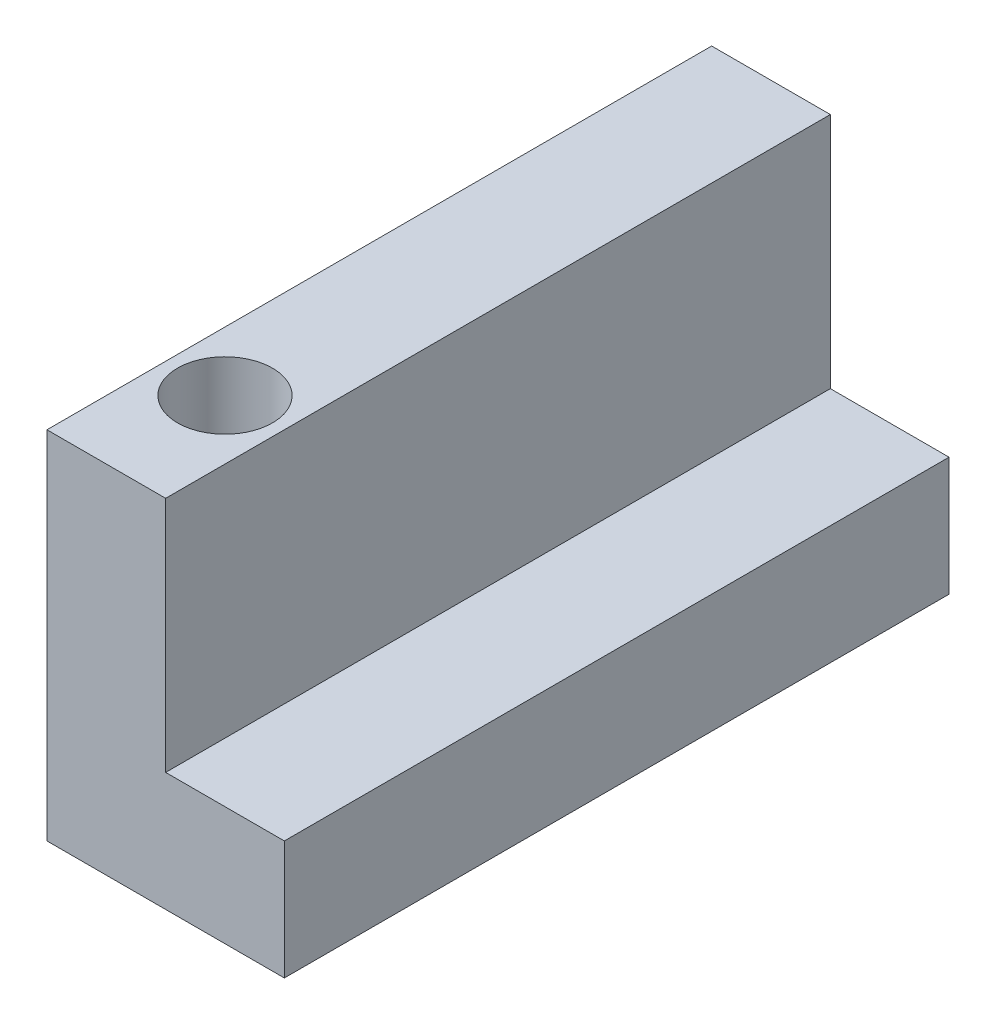
ISO-10303-21;
HEADER;
FILE_DESCRIPTION(('STEP AP214'),'2;1');
FILE_NAME('part.step','',(''),(''),'','','');
FILE_SCHEMA(('AUTOMOTIVE_DESIGN { 1 0 10303 214 1 1 1 1 }'));
ENDSEC;
DATA;
#1=APPLICATION_CONTEXT('core data for automotive mechanical design processes');
#2=APPLICATION_PROTOCOL_DEFINITION('international standard','automotive_design',2000,#1);
#3=PRODUCT_CONTEXT('',#1,'mechanical');
#4=PRODUCT('Part','Part','',(#3));
#5=PRODUCT_RELATED_PRODUCT_CATEGORY('part','',(#4));
#6=PRODUCT_DEFINITION_FORMATION('','',#4);
#7=PRODUCT_DEFINITION_CONTEXT('part definition',#1,'design');
#8=PRODUCT_DEFINITION('design','',#6,#7);
#9=PRODUCT_DEFINITION_SHAPE('','',#8);
#10=(LENGTH_UNIT() NAMED_UNIT(*) SI_UNIT(.MILLI.,.METRE.));
#11=(NAMED_UNIT(*) PLANE_ANGLE_UNIT() SI_UNIT($,.RADIAN.));
#12=(NAMED_UNIT(*) SI_UNIT($,.STERADIAN.) SOLID_ANGLE_UNIT());
#13=UNCERTAINTY_MEASURE_WITH_UNIT(LENGTH_MEASURE(1.E-05),#10,'distance_accuracy_value','');
#14=(GEOMETRIC_REPRESENTATION_CONTEXT(3) GLOBAL_UNCERTAINTY_ASSIGNED_CONTEXT((#13)) GLOBAL_UNIT_ASSIGNED_CONTEXT((#10,
#11,#12)) REPRESENTATION_CONTEXT('',''));
#15=CARTESIAN_POINT('',(0.,0.,0.));
#16=DIRECTION('',(0.,0.,1.));
#17=DIRECTION('',(1.,0.,0.));
#18=AXIS2_PLACEMENT_3D('',#15,#16,#17);
#19=CARTESIAN_POINT('',(0.,6.35,-381.));
#20=DIRECTION('',(1.,0.,0.));
#21=DIRECTION('',(0.,0.,-1.));
#22=AXIS2_PLACEMENT_3D('',#19,#20,#21);
#23=PLANE('',#22);
#24=DIRECTION('',(0.,-1.,0.));
#25=VECTOR('',#24,1.);
#26=CARTESIAN_POINT('',(0.,6.35,-35.56));
#27=LINE('',#26,#25);
#28=CARTESIAN_POINT('',(0.,6.35,-35.56));
#29=VERTEX_POINT('',#28);
#30=CARTESIAN_POINT('',(0.,0.,-35.56));
#31=VERTEX_POINT('',#30);
#32=EDGE_CURVE('E101',#29,#31,#27,.T.);
#33=ORIENTED_EDGE('',*,*,#32,.F.);
#34=DIRECTION('',(0.,0.,1.));
#35=VECTOR('',#34,1.);
#36=CARTESIAN_POINT('',(0.,6.35,-381.));
#37=LINE('',#36,#35);
#38=CARTESIAN_POINT('',(0.,6.35,0.));
#39=VERTEX_POINT('',#38);
#40=EDGE_CURVE('E45',#29,#39,#37,.T.);
#41=ORIENTED_EDGE('',*,*,#40,.T.);
#42=DIRECTION('',(0.,1.,0.));
#43=VECTOR('',#42,1.);
#44=CARTESIAN_POINT('',(0.,6.35,0.));
#45=LINE('',#44,#43);
#46=CARTESIAN_POINT('',(0.,0.,0.));
#47=VERTEX_POINT('',#46);
#48=EDGE_CURVE('E153',#47,#39,#45,.T.);
#49=ORIENTED_EDGE('',*,*,#48,.F.);
#50=DIRECTION('',(0.,0.,1.));
#51=VECTOR('',#50,1.);
#52=CARTESIAN_POINT('',(0.,0.,-381.));
#53=LINE('',#52,#51);
#54=EDGE_CURVE('E11',#31,#47,#53,.T.);
#55=ORIENTED_EDGE('',*,*,#54,.F.);
#56=EDGE_LOOP('',(#33,#41,#49,#55));
#57=FACE_BOUND('',#56,.T.);
#58=ADVANCED_FACE('F42',(#57),#23,.T.);
#59=CARTESIAN_POINT('',(0.,0.,-381.));
#60=DIRECTION('',(0.,-1.,0.));
#61=DIRECTION('',(1.,0.,0.));
#62=AXIS2_PLACEMENT_3D('',#59,#60,#61);
#63=PLANE('',#62);
#64=DIRECTION('',(0.,0.,1.));
#65=VECTOR('',#64,1.);
#66=CARTESIAN_POINT('',(-12.7,0.,-381.));
#67=LINE('',#66,#65);
#68=CARTESIAN_POINT('',(-12.7,0.,-35.56));
#69=VERTEX_POINT('',#68);
#70=CARTESIAN_POINT('',(-12.7,0.,0.));
#71=VERTEX_POINT('',#70);
#72=EDGE_CURVE('E51',#69,#71,#67,.T.);
#73=ORIENTED_EDGE('',*,*,#72,.F.);
#74=DIRECTION('',(-1.,0.,0.));
#75=VECTOR('',#74,1.);
#76=CARTESIAN_POINT('',(-6.35,0.,-35.56));
#77=LINE('',#76,#75);
#78=EDGE_CURVE('E96',#31,#69,#77,.T.);
#79=ORIENTED_EDGE('',*,*,#78,.F.);
#80=ORIENTED_EDGE('',*,*,#54,.T.);
#81=DIRECTION('',(1.,0.,0.));
#82=VECTOR('',#81,1.);
#83=CARTESIAN_POINT('',(0.,0.,0.));
#84=LINE('',#83,#82);
#85=EDGE_CURVE('E115',#71,#47,#84,.T.);
#86=ORIENTED_EDGE('',*,*,#85,.F.);
#87=EDGE_LOOP('',(#73,#79,#80,#86));
#88=FACE_BOUND('',#87,.T.);
#89=CARTESIAN_POINT('',(-9.525,0.,-6.35));
#90=DIRECTION('',(0.,-1.,0.));
#91=DIRECTION('',(1.,0.,0.));
#92=AXIS2_PLACEMENT_3D('',#89,#90,#91);
#93=CIRCLE('',#92,2.54);
#94=CARTESIAN_POINT('',(-6.985,0.,-6.35));
#95=VERTEX_POINT('',#94);
#96=EDGE_CURVE('E161',#95,#95,#93,.T.);
#97=ORIENTED_EDGE('',*,*,#96,.F.);
#98=EDGE_LOOP('',(#97));
#99=FACE_BOUND('',#98,.T.);
#100=ADVANCED_FACE('F112',(#88,#99),#63,.T.);
#101=CARTESIAN_POINT('',(-12.7,0.,-381.));
#102=DIRECTION('',(-1.,0.,0.));
#103=DIRECTION('',(0.,-1.,0.));
#104=AXIS2_PLACEMENT_3D('',#101,#102,#103);
#105=PLANE('',#104);
#106=DIRECTION('',(0.,-1.,0.));
#107=VECTOR('',#106,1.);
#108=CARTESIAN_POINT('',(-12.7,0.,-35.56));
#109=LINE('',#108,#107);
#110=CARTESIAN_POINT('',(-12.7,19.05,-35.56));
#111=VERTEX_POINT('',#110);
#112=EDGE_CURVE('E98',#111,#69,#109,.T.);
#113=ORIENTED_EDGE('',*,*,#112,.T.);
#114=ORIENTED_EDGE('',*,*,#72,.T.);
#115=DIRECTION('',(0.,-1.,0.));
#116=VECTOR('',#115,1.);
#117=CARTESIAN_POINT('',(-12.7,0.,0.));
#118=LINE('',#117,#116);
#119=CARTESIAN_POINT('',(-12.7,19.05,0.));
#120=VERTEX_POINT('',#119);
#121=EDGE_CURVE('E135',#120,#71,#118,.T.);
#122=ORIENTED_EDGE('',*,*,#121,.F.);
#123=DIRECTION('',(0.,0.,1.));
#124=VECTOR('',#123,1.);
#125=CARTESIAN_POINT('',(-12.7,19.05,-381.));
#126=LINE('',#125,#124);
#127=EDGE_CURVE('E107',#111,#120,#126,.T.);
#128=ORIENTED_EDGE('',*,*,#127,.F.);
#129=EDGE_LOOP('',(#113,#114,#122,#128));
#130=FACE_BOUND('',#129,.T.);
#131=ADVANCED_FACE('F106',(#130),#105,.T.);
#132=CARTESIAN_POINT('',(-12.7,19.05,-381.));
#133=DIRECTION('',(0.,1.,0.));
#134=DIRECTION('',(0.,0.,1.));
#135=AXIS2_PLACEMENT_3D('',#132,#133,#134);
#136=PLANE('',#135);
#137=DIRECTION('',(1.,0.,0.));
#138=VECTOR('',#137,1.);
#139=CARTESIAN_POINT('',(-12.7,19.05,-35.56));
#140=LINE('',#139,#138);
#141=CARTESIAN_POINT('',(-6.35,19.05,-35.56));
#142=VERTEX_POINT('',#141);
#143=EDGE_CURVE('E109',#111,#142,#140,.T.);
#144=ORIENTED_EDGE('',*,*,#143,.F.);
#145=ORIENTED_EDGE('',*,*,#127,.T.);
#146=DIRECTION('',(-1.,0.,0.));
#147=VECTOR('',#146,1.);
#148=CARTESIAN_POINT('',(-12.7,19.05,0.));
#149=LINE('',#148,#147);
#150=CARTESIAN_POINT('',(-6.35,19.05,0.));
#151=VERTEX_POINT('',#150);
#152=EDGE_CURVE('E139',#151,#120,#149,.T.);
#153=ORIENTED_EDGE('',*,*,#152,.F.);
#154=DIRECTION('',(0.,0.,1.));
#155=VECTOR('',#154,1.);
#156=CARTESIAN_POINT('',(-6.35,19.05,-381.));
#157=LINE('',#156,#155);
#158=EDGE_CURVE('E119',#142,#151,#157,.T.);
#159=ORIENTED_EDGE('',*,*,#158,.F.);
#160=EDGE_LOOP('',(#144,#145,#153,#159));
#161=FACE_BOUND('',#160,.T.);
#162=CARTESIAN_POINT('',(-9.525,19.05,-6.35));
#163=DIRECTION('',(0.,1.,0.));
#164=DIRECTION('',(0.,0.,1.));
#165=AXIS2_PLACEMENT_3D('',#162,#163,#164);
#166=CIRCLE('',#165,2.54);
#167=CARTESIAN_POINT('',(-9.525,19.05,-3.81));
#168=VERTEX_POINT('',#167);
#169=EDGE_CURVE('E157',#168,#168,#166,.T.);
#170=ORIENTED_EDGE('',*,*,#169,.F.);
#171=EDGE_LOOP('',(#170));
#172=FACE_BOUND('',#171,.T.);
#173=ADVANCED_FACE('F194',(#161,#172),#136,.T.);
#174=CARTESIAN_POINT('',(-6.35,19.05,-381.));
#175=DIRECTION('',(1.,0.,0.));
#176=DIRECTION('',(0.,1.,0.));
#177=AXIS2_PLACEMENT_3D('',#174,#175,#176);
#178=PLANE('',#177);
#179=DIRECTION('',(0.,-1.,0.));
#180=VECTOR('',#179,1.);
#181=CARTESIAN_POINT('',(-6.35,0.,-35.56));
#182=LINE('',#181,#180);
#183=CARTESIAN_POINT('',(-6.35,6.35,-35.56));
#184=VERTEX_POINT('',#183);
#185=EDGE_CURVE('E110',#142,#184,#182,.T.);
#186=ORIENTED_EDGE('',*,*,#185,.F.);
#187=ORIENTED_EDGE('',*,*,#158,.T.);
#188=DIRECTION('',(0.,1.,0.));
#189=VECTOR('',#188,1.);
#190=CARTESIAN_POINT('',(-6.35,19.05,0.));
#191=LINE('',#190,#189);
#192=CARTESIAN_POINT('',(-6.35,6.35,0.));
#193=VERTEX_POINT('',#192);
#194=EDGE_CURVE('E145',#193,#151,#191,.T.);
#195=ORIENTED_EDGE('',*,*,#194,.F.);
#196=DIRECTION('',(0.,0.,1.));
#197=VECTOR('',#196,1.);
#198=CARTESIAN_POINT('',(-6.35,6.35,-381.));
#199=LINE('',#198,#197);
#200=EDGE_CURVE('E124',#184,#193,#199,.T.);
#201=ORIENTED_EDGE('',*,*,#200,.F.);
#202=EDGE_LOOP('',(#186,#187,#195,#201));
#203=FACE_BOUND('',#202,.T.);
#204=ADVANCED_FACE('F183',(#203),#178,.T.);
#205=CARTESIAN_POINT('',(-6.35,6.35,-381.));
#206=DIRECTION('',(0.,1.,0.));
#207=DIRECTION('',(0.,0.,1.));
#208=AXIS2_PLACEMENT_3D('',#205,#206,#207);
#209=PLANE('',#208);
#210=DIRECTION('',(1.,0.,0.));
#211=VECTOR('',#210,1.);
#212=CARTESIAN_POINT('',(-6.35,6.35,-35.56));
#213=LINE('',#212,#211);
#214=EDGE_CURVE('E173',#184,#29,#213,.T.);
#215=ORIENTED_EDGE('',*,*,#214,.F.);
#216=ORIENTED_EDGE('',*,*,#200,.T.);
#217=DIRECTION('',(-1.,0.,0.));
#218=VECTOR('',#217,1.);
#219=CARTESIAN_POINT('',(-6.35,6.35,0.));
#220=LINE('',#219,#218);
#221=EDGE_CURVE('E149',#39,#193,#220,.T.);
#222=ORIENTED_EDGE('',*,*,#221,.F.);
#223=ORIENTED_EDGE('',*,*,#40,.F.);
#224=EDGE_LOOP('',(#215,#216,#222,#223));
#225=FACE_BOUND('',#224,.T.);
#226=ADVANCED_FACE('F182',(#225),#209,.T.);
#227=CARTESIAN_POINT('',(0.,0.,0.));
#228=DIRECTION('',(0.,0.,-1.));
#229=DIRECTION('',(-1.,0.,0.));
#230=AXIS2_PLACEMENT_3D('',#227,#228,#229);
#231=PLANE('',#230);
#232=ORIENTED_EDGE('',*,*,#48,.T.);
#233=ORIENTED_EDGE('',*,*,#221,.T.);
#234=ORIENTED_EDGE('',*,*,#194,.T.);
#235=ORIENTED_EDGE('',*,*,#152,.T.);
#236=ORIENTED_EDGE('',*,*,#121,.T.);
#237=ORIENTED_EDGE('',*,*,#85,.T.);
#238=EDGE_LOOP('',(#232,#233,#234,#235,#236,#237));
#239=FACE_BOUND('',#238,.T.);
#240=ADVANCED_FACE('F185',(#239),#231,.F.);
#241=CARTESIAN_POINT('',(-9.525,11.43,-6.35));
#242=DIRECTION('',(0.,1.,0.));
#243=DIRECTION('',(0.,0.,1.));
#244=AXIS2_PLACEMENT_3D('',#241,#242,#243);
#245=CYLINDRICAL_SURFACE('',#244,2.54);
#246=CARTESIAN_POINT('',(-9.525,11.43,-6.35));
#247=DIRECTION('',(0.,1.,0.));
#248=DIRECTION('',(0.,0.,1.));
#249=AXIS2_PLACEMENT_3D('',#246,#247,#248);
#250=CIRCLE('',#249,2.54);
#251=CARTESIAN_POINT('',(-9.525,11.43,-3.81));
#252=VERTEX_POINT('',#251);
#253=EDGE_CURVE('E156',#252,#252,#250,.T.);
#254=CARTESIAN_POINT('',(-9.525,11.43,-3.81));
#255=CARTESIAN_POINT('',(-9.525,11.509375,-3.81));
#256=CARTESIAN_POINT('',(-9.525,11.58875,-3.81));
#257=CARTESIAN_POINT('',(-9.525,11.7475,-3.81));
#258=CARTESIAN_POINT('',(-9.525,11.826875,-3.81));
#259=CARTESIAN_POINT('',(-9.525,11.985625,-3.81));
#260=CARTESIAN_POINT('',(-9.525,12.065,-3.81));
#261=CARTESIAN_POINT('',(-9.525,12.22375,-3.81));
#262=CARTESIAN_POINT('',(-9.525,12.303125,-3.81));
#263=CARTESIAN_POINT('',(-9.525,12.461875,-3.81));
#264=CARTESIAN_POINT('',(-9.525,12.54125,-3.81));
#265=CARTESIAN_POINT('',(-9.525,12.7,-3.81));
#266=CARTESIAN_POINT('',(-9.525,12.779375,-3.81));
#267=CARTESIAN_POINT('',(-9.525,12.938125,-3.81));
#268=CARTESIAN_POINT('',(-9.525,13.0175,-3.81));
#269=CARTESIAN_POINT('',(-9.525,13.17625,-3.81));
#270=CARTESIAN_POINT('',(-9.525,13.255625,-3.81));
#271=CARTESIAN_POINT('',(-9.525,13.414375,-3.81));
#272=CARTESIAN_POINT('',(-9.525,13.49375,-3.81));
#273=CARTESIAN_POINT('',(-9.525,13.6525,-3.81));
#274=CARTESIAN_POINT('',(-9.525,13.731875,-3.81));
#275=CARTESIAN_POINT('',(-9.525,13.890625,-3.81));
#276=CARTESIAN_POINT('',(-9.525,13.97,-3.81));
#277=CARTESIAN_POINT('',(-9.525,14.12875,-3.81));
#278=CARTESIAN_POINT('',(-9.525,14.208125,-3.81));
#279=CARTESIAN_POINT('',(-9.525,14.366875,-3.81));
#280=CARTESIAN_POINT('',(-9.525,14.44625,-3.81));
#281=CARTESIAN_POINT('',(-9.525,14.605,-3.81));
#282=CARTESIAN_POINT('',(-9.525,14.684375,-3.81));
#283=CARTESIAN_POINT('',(-9.525,14.843125,-3.81));
#284=CARTESIAN_POINT('',(-9.525,14.9225,-3.81));
#285=CARTESIAN_POINT('',(-9.525,15.08125,-3.81));
#286=CARTESIAN_POINT('',(-9.525,15.160625,-3.81));
#287=CARTESIAN_POINT('',(-9.525,15.319375,-3.81));
#288=CARTESIAN_POINT('',(-9.525,15.39875,-3.81));
#289=CARTESIAN_POINT('',(-9.525,15.5575,-3.81));
#290=CARTESIAN_POINT('',(-9.525,15.636875,-3.81));
#291=CARTESIAN_POINT('',(-9.525,15.795625,-3.81));
#292=CARTESIAN_POINT('',(-9.525,15.875,-3.81));
#293=CARTESIAN_POINT('',(-9.525,16.03375,-3.81));
#294=CARTESIAN_POINT('',(-9.525,16.113125,-3.81));
#295=CARTESIAN_POINT('',(-9.525,16.271875,-3.81));
#296=CARTESIAN_POINT('',(-9.525,16.35125,-3.81));
#297=CARTESIAN_POINT('',(-9.525,16.51,-3.81));
#298=CARTESIAN_POINT('',(-9.525,16.589375,-3.81));
#299=CARTESIAN_POINT('',(-9.525,16.748125,-3.81));
#300=CARTESIAN_POINT('',(-9.525,16.8275,-3.81));
#301=CARTESIAN_POINT('',(-9.525,16.98625,-3.81));
#302=CARTESIAN_POINT('',(-9.525,17.065625,-3.81));
#303=CARTESIAN_POINT('',(-9.525,17.224375,-3.81));
#304=CARTESIAN_POINT('',(-9.525,17.30375,-3.81));
#305=CARTESIAN_POINT('',(-9.525,17.4625,-3.81));
#306=CARTESIAN_POINT('',(-9.525,17.541875,-3.81));
#307=CARTESIAN_POINT('',(-9.525,17.700625,-3.81));
#308=CARTESIAN_POINT('',(-9.525,17.78,-3.81));
#309=CARTESIAN_POINT('',(-9.525,17.93875,-3.81));
#310=CARTESIAN_POINT('',(-9.525,18.018125,-3.81));
#311=CARTESIAN_POINT('',(-9.525,18.176875,-3.81));
#312=CARTESIAN_POINT('',(-9.525,18.25625,-3.81));
#313=CARTESIAN_POINT('',(-9.525,18.415,-3.81));
#314=CARTESIAN_POINT('',(-9.525,18.494375,-3.81));
#315=CARTESIAN_POINT('',(-9.525,18.653125,-3.81));
#316=CARTESIAN_POINT('',(-9.525,18.7325,-3.81));
#317=CARTESIAN_POINT('',(-9.525,18.89125,-3.81));
#318=CARTESIAN_POINT('',(-9.525,18.970625,-3.81));
#319=CARTESIAN_POINT('',(-9.525,19.05,-3.81));
#320=B_SPLINE_CURVE_WITH_KNOTS('',3,(#254,#255,#256,#257,#258,#259,#260,#261,#262,#263,#264,
#265,#266,#267,#268,#269,#270,#271,#272,#273,#274,#275,#276,#277,#278,#279,#280,#281,#282,#283,
#284,#285,#286,#287,#288,#289,#290,#291,#292,#293,#294,#295,#296,#297,#298,#299,#300,#301,#302,
#303,#304,#305,#306,#307,#308,#309,#310,#311,#312,#313,#314,#315,#316,#317,#318,#319),
.UNSPECIFIED.,.F.,.F.,(4,2,2,2,2,2,2,2,2,2,2,2,2,2,2,2,2,2,2,2,2,2,2,2,2,2,2,2,2,2,2,2,4),(0.,
0.238125,0.476250000000001,0.714375,0.9525,1.190625,1.42875,1.666875,1.905,2.143125,2.38125,
2.619375,2.8575,3.095625,3.33375,3.571875,3.81,4.048125,4.28625,4.524375,4.7625,5.000625,
5.23875,5.476875,5.715,5.953125,6.19125,6.429375,6.6675,6.905625,7.14375,7.381875,7.62),.UNSPECIFIED.);
#321=EDGE_CURVE('BSEAM208',#252,#168,#320,.T.);
#322=ORIENTED_EDGE('',*,*,#253,.F.);
#323=ORIENTED_EDGE('',*,*,#169,.T.);
#324=ORIENTED_EDGE('',*,*,#321,.T.);
#325=ORIENTED_EDGE('',*,*,#321,.F.);
#326=EDGE_LOOP('',(#322,#324,#323,#325));
#327=FACE_BOUND('',#326,.T.);
#328=ADVANCED_FACE('F208',(#327),#245,.F.);
#329=CARTESIAN_POINT('',(-9.525,11.43,-6.35));
#330=DIRECTION('',(0.,1.,0.));
#331=DIRECTION('',(0.,0.,1.));
#332=AXIS2_PLACEMENT_3D('',#329,#330,#331);
#333=PLANE('',#332);
#334=ORIENTED_EDGE('',*,*,#253,.T.);
#335=EDGE_LOOP('',(#334));
#336=FACE_BOUND('',#335,.T.);
#337=ADVANCED_FACE('F212',(#336),#333,.T.);
#338=CARTESIAN_POINT('',(-9.525,7.62,-6.35));
#339=DIRECTION('',(0.,-1.,0.));
#340=DIRECTION('',(1.,0.,0.));
#341=AXIS2_PLACEMENT_3D('',#338,#339,#340);
#342=CYLINDRICAL_SURFACE('',#341,2.54);
#343=CARTESIAN_POINT('',(-9.525,7.62,-6.35));
#344=DIRECTION('',(0.,-1.,0.));
#345=DIRECTION('',(1.,0.,0.));
#346=AXIS2_PLACEMENT_3D('',#343,#344,#345);
#347=CIRCLE('',#346,2.54);
#348=CARTESIAN_POINT('',(-6.985,7.62,-6.35));
#349=VERTEX_POINT('',#348);
#350=EDGE_CURVE('E103',#349,#349,#347,.T.);
#351=CARTESIAN_POINT('',(-6.985,7.62,-6.35));
#352=CARTESIAN_POINT('',(-6.985,7.540625,-6.35));
#353=CARTESIAN_POINT('',(-6.985,7.46125,-6.35));
#354=CARTESIAN_POINT('',(-6.985,7.3025,-6.35));
#355=CARTESIAN_POINT('',(-6.985,7.223125,-6.35));
#356=CARTESIAN_POINT('',(-6.985,7.064375,-6.35));
#357=CARTESIAN_POINT('',(-6.985,6.985,-6.35));
#358=CARTESIAN_POINT('',(-6.985,6.82625,-6.35));
#359=CARTESIAN_POINT('',(-6.985,6.746875,-6.35));
#360=CARTESIAN_POINT('',(-6.985,6.588125,-6.35));
#361=CARTESIAN_POINT('',(-6.985,6.50875,-6.35));
#362=CARTESIAN_POINT('',(-6.985,6.35,-6.35));
#363=CARTESIAN_POINT('',(-6.985,6.270625,-6.35));
#364=CARTESIAN_POINT('',(-6.985,6.111875,-6.35));
#365=CARTESIAN_POINT('',(-6.985,6.0325,-6.35));
#366=CARTESIAN_POINT('',(-6.985,5.87375,-6.35));
#367=CARTESIAN_POINT('',(-6.985,5.794375,-6.35));
#368=CARTESIAN_POINT('',(-6.985,5.635625,-6.35));
#369=CARTESIAN_POINT('',(-6.985,5.55625,-6.35));
#370=CARTESIAN_POINT('',(-6.985,5.3975,-6.35));
#371=CARTESIAN_POINT('',(-6.985,5.318125,-6.35));
#372=CARTESIAN_POINT('',(-6.985,5.159375,-6.35));
#373=CARTESIAN_POINT('',(-6.985,5.08,-6.35));
#374=CARTESIAN_POINT('',(-6.985,4.92125,-6.35));
#375=CARTESIAN_POINT('',(-6.985,4.841875,-6.35));
#376=CARTESIAN_POINT('',(-6.985,4.683125,-6.35));
#377=CARTESIAN_POINT('',(-6.985,4.60375,-6.35));
#378=CARTESIAN_POINT('',(-6.985,4.445,-6.35));
#379=CARTESIAN_POINT('',(-6.985,4.365625,-6.35));
#380=CARTESIAN_POINT('',(-6.985,4.206875,-6.35));
#381=CARTESIAN_POINT('',(-6.985,4.1275,-6.35));
#382=CARTESIAN_POINT('',(-6.985,3.96875,-6.35));
#383=CARTESIAN_POINT('',(-6.985,3.889375,-6.35));
#384=CARTESIAN_POINT('',(-6.985,3.730625,-6.35));
#385=CARTESIAN_POINT('',(-6.985,3.65125,-6.35));
#386=CARTESIAN_POINT('',(-6.985,3.4925,-6.35));
#387=CARTESIAN_POINT('',(-6.985,3.413125,-6.35));
#388=CARTESIAN_POINT('',(-6.985,3.254375,-6.35));
#389=CARTESIAN_POINT('',(-6.985,3.175,-6.35));
#390=CARTESIAN_POINT('',(-6.985,3.01625,-6.35));
#391=CARTESIAN_POINT('',(-6.985,2.936875,-6.35));
#392=CARTESIAN_POINT('',(-6.985,2.778125,-6.35));
#393=CARTESIAN_POINT('',(-6.985,2.69875,-6.35));
#394=CARTESIAN_POINT('',(-6.985,2.54,-6.35));
#395=CARTESIAN_POINT('',(-6.985,2.460625,-6.35));
#396=CARTESIAN_POINT('',(-6.985,2.301875,-6.35));
#397=CARTESIAN_POINT('',(-6.985,2.2225,-6.35));
#398=CARTESIAN_POINT('',(-6.985,2.06375,-6.35));
#399=CARTESIAN_POINT('',(-6.985,1.984375,-6.35));
#400=CARTESIAN_POINT('',(-6.985,1.825625,-6.35));
#401=CARTESIAN_POINT('',(-6.985,1.74625,-6.35));
#402=CARTESIAN_POINT('',(-6.985,1.5875,-6.35));
#403=CARTESIAN_POINT('',(-6.985,1.508125,-6.35));
#404=CARTESIAN_POINT('',(-6.985,1.349375,-6.35));
#405=CARTESIAN_POINT('',(-6.985,1.27,-6.35));
#406=CARTESIAN_POINT('',(-6.985,1.11125,-6.35));
#407=CARTESIAN_POINT('',(-6.985,1.031875,-6.35));
#408=CARTESIAN_POINT('',(-6.985,0.873125,-6.35));
#409=CARTESIAN_POINT('',(-6.985,0.79375,-6.35));
#410=CARTESIAN_POINT('',(-6.985,0.635,-6.35));
#411=CARTESIAN_POINT('',(-6.985,0.555625,-6.35));
#412=CARTESIAN_POINT('',(-6.985,0.396875,-6.35));
#413=CARTESIAN_POINT('',(-6.985,0.3175,-6.35));
#414=CARTESIAN_POINT('',(-6.985,0.15875,-6.35));
#415=CARTESIAN_POINT('',(-6.985,0.0793749999999999,-6.35));
#416=CARTESIAN_POINT('',(-6.985,0.,-6.35));
#417=B_SPLINE_CURVE_WITH_KNOTS('',3,(#351,#352,#353,#354,#355,#356,#357,#358,#359,#360,#361,
#362,#363,#364,#365,#366,#367,#368,#369,#370,#371,#372,#373,#374,#375,#376,#377,#378,#379,#380,
#381,#382,#383,#384,#385,#386,#387,#388,#389,#390,#391,#392,#393,#394,#395,#396,#397,#398,#399,
#400,#401,#402,#403,#404,#405,#406,#407,#408,#409,#410,#411,#412,#413,#414,#415,#416),
.UNSPECIFIED.,.F.,.F.,(4,2,2,2,2,2,2,2,2,2,2,2,2,2,2,2,2,2,2,2,2,2,2,2,2,2,2,2,2,2,2,2,4),(0.,
0.238125,0.47625,0.714375000000001,0.9525,1.190625,1.42875,1.666875,1.905,2.143125,2.38125,
2.619375,2.8575,3.095625,3.33375,3.571875,3.81,4.048125,4.28625,4.524375,4.7625,5.000625,
5.23875,5.476875,5.715,5.953125,6.19125,6.429375,6.6675,6.905625,7.14375,7.381875,7.62),.UNSPECIFIED.);
#418=EDGE_CURVE('BSEAM217',#349,#95,#417,.T.);
#419=ORIENTED_EDGE('',*,*,#350,.F.);
#420=ORIENTED_EDGE('',*,*,#96,.T.);
#421=ORIENTED_EDGE('',*,*,#418,.T.);
#422=ORIENTED_EDGE('',*,*,#418,.F.);
#423=EDGE_LOOP('',(#419,#421,#420,#422));
#424=FACE_BOUND('',#423,.T.);
#425=ADVANCED_FACE('F217',(#424),#342,.F.);
#426=CARTESIAN_POINT('',(-9.525,7.62,-6.35));
#427=DIRECTION('',(0.,-1.,0.));
#428=DIRECTION('',(1.,0.,0.));
#429=AXIS2_PLACEMENT_3D('',#426,#427,#428);
#430=PLANE('',#429);
#431=ORIENTED_EDGE('',*,*,#350,.T.);
#432=EDGE_LOOP('',(#431));
#433=FACE_BOUND('',#432,.T.);
#434=ADVANCED_FACE('F223',(#433),#430,.T.);
#435=CARTESIAN_POINT('',(0.,0.,-35.56));
#436=DIRECTION('',(0.,0.,1.));
#437=DIRECTION('',(1.,0.,0.));
#438=AXIS2_PLACEMENT_3D('',#435,#436,#437);
#439=PLANE('',#438);
#440=ORIENTED_EDGE('',*,*,#78,.T.);
#441=ORIENTED_EDGE('',*,*,#112,.F.);
#442=ORIENTED_EDGE('',*,*,#143,.T.);
#443=ORIENTED_EDGE('',*,*,#185,.T.);
#444=ORIENTED_EDGE('',*,*,#214,.T.);
#445=ORIENTED_EDGE('',*,*,#32,.T.);
#446=EDGE_LOOP('',(#440,#441,#442,#443,#444,#445));
#447=FACE_BOUND('',#446,.T.);
#448=ADVANCED_FACE('F97',(#447),#439,.F.);
#449=CLOSED_SHELL('',(#58,#100,#131,#173,#204,#226,#240,#328,#337,#425,#434,#448));
#450=MANIFOLD_SOLID_BREP('B2',#449);
#451=ADVANCED_BREP_SHAPE_REPRESENTATION('',(#18,#450),#14);
#452=SHAPE_DEFINITION_REPRESENTATION(#9,#451);
ENDSEC;
END-ISO-10303-21;
